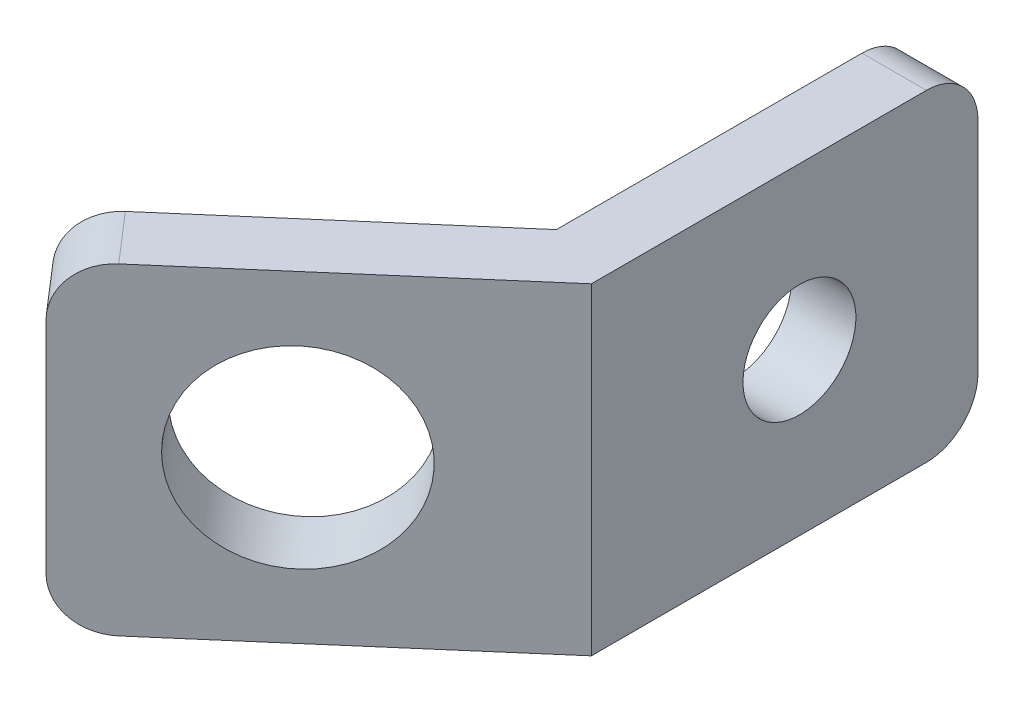
ISO-10303-21;
HEADER;
FILE_DESCRIPTION(('STEP AP214'),'2;1');
FILE_NAME('part.step','',(''),(''),'','','');
FILE_SCHEMA(('AUTOMOTIVE_DESIGN { 1 0 10303 214 1 1 1 1 }'));
ENDSEC;
DATA;
#1=APPLICATION_CONTEXT('core data for automotive mechanical design processes');
#2=APPLICATION_PROTOCOL_DEFINITION('international standard','automotive_design',2000,#1);
#3=PRODUCT_CONTEXT('',#1,'mechanical');
#4=PRODUCT('Part','Part','',(#3));
#5=PRODUCT_RELATED_PRODUCT_CATEGORY('part','',(#4));
#6=PRODUCT_DEFINITION_FORMATION('','',#4);
#7=PRODUCT_DEFINITION_CONTEXT('part definition',#1,'design');
#8=PRODUCT_DEFINITION('design','',#6,#7);
#9=PRODUCT_DEFINITION_SHAPE('','',#8);
#10=(LENGTH_UNIT() NAMED_UNIT(*) SI_UNIT(.MILLI.,.METRE.));
#11=(NAMED_UNIT(*) PLANE_ANGLE_UNIT() SI_UNIT($,.RADIAN.));
#12=(NAMED_UNIT(*) SI_UNIT($,.STERADIAN.) SOLID_ANGLE_UNIT());
#13=UNCERTAINTY_MEASURE_WITH_UNIT(LENGTH_MEASURE(1.E-05),#10,'distance_accuracy_value','');
#14=(GEOMETRIC_REPRESENTATION_CONTEXT(3) GLOBAL_UNCERTAINTY_ASSIGNED_CONTEXT((#13)) GLOBAL_UNIT_ASSIGNED_CONTEXT((#10,
#11,#12)) REPRESENTATION_CONTEXT('',''));
#15=CARTESIAN_POINT('',(0.,0.,0.));
#16=DIRECTION('',(0.,0.,1.));
#17=DIRECTION('',(1.,0.,0.));
#18=AXIS2_PLACEMENT_3D('',#15,#16,#17);
#19=CARTESIAN_POINT('',(-14.4153433207291,15.875,12.4539301806904));
#20=DIRECTION('',(-0.653749615784273,0.,-0.756710935471343));
#21=DIRECTION('',(-0.756710935471343,0.,0.653749615784273));
#22=AXIS2_PLACEMENT_3D('',#19,#20,#21);
#23=PLANE('',#22);
#24=CARTESIAN_POINT('',(-7.75734414530701,7.9375,6.70184679086469));
#25=DIRECTION('',(-0.653749615784273,0.,-0.756710935471343));
#26=DIRECTION('',(-0.756710935471343,0.,0.653749615784273));
#27=AXIS2_PLACEMENT_3D('',#24,#25,#26);
#28=CIRCLE('',#27,4.7625);
#29=CARTESIAN_POINT('',(-11.3611799754893,7.9375,9.81532933603729));
#30=VERTEX_POINT('',#29);
#31=EDGE_CURVE('E301',#30,#30,#28,.T.);
#32=ORIENTED_EDGE('',*,*,#31,.T.);
#33=EDGE_LOOP('',(#32));
#34=FACE_BOUND('',#33,.T.);
#35=DIRECTION('',(0.,-1.,0.));
#36=VECTOR('',#35,1.);
#37=CARTESIAN_POINT('',(-14.4153433207291,15.875,12.4539301806904));
#38=LINE('',#37,#36);
#39=CARTESIAN_POINT('',(-14.4153433207291,13.335,12.4539301806904));
#40=VERTEX_POINT('',#39);
#41=CARTESIAN_POINT('',(-14.4153433207291,2.54,12.4539301806904));
#42=VERTEX_POINT('',#41);
#43=EDGE_CURVE('E210',#40,#42,#38,.T.);
#44=ORIENTED_EDGE('',*,*,#43,.T.);
#45=CARTESIAN_POINT('',(-12.4932975446319,2.54,10.7934061565984));
#46=DIRECTION('',(-0.653749615784273,0.,-0.756710935471343));
#47=DIRECTION('',(-0.756710935471343,0.,0.653749615784273));
#48=AXIS2_PLACEMENT_3D('',#45,#46,#47);
#49=CIRCLE('',#48,2.54);
#50=CARTESIAN_POINT('',(-12.4932975446319,0.,10.7934061565984));
#51=VERTEX_POINT('',#50);
#52=EDGE_CURVE('E197',#42,#51,#49,.F.);
#53=ORIENTED_EDGE('',*,*,#52,.T.);
#54=DIRECTION('',(0.756710935471343,0.,-0.653749615784273));
#55=VECTOR('',#54,1.);
#56=CARTESIAN_POINT('',(-14.4153433207291,0.,12.4539301806904));
#57=LINE('',#56,#55);
#58=CARTESIAN_POINT('',(0.,0.,0.));
#59=VERTEX_POINT('',#58);
#60=EDGE_CURVE('E148',#51,#59,#57,.T.);
#61=ORIENTED_EDGE('',*,*,#60,.T.);
#62=DIRECTION('',(0.,-1.,0.));
#63=VECTOR('',#62,1.);
#64=CARTESIAN_POINT('',(0.,15.875,0.));
#65=LINE('',#64,#63);
#66=CARTESIAN_POINT('',(0.,15.875,0.));
#67=VERTEX_POINT('',#66);
#68=EDGE_CURVE('E140',#67,#59,#65,.T.);
#69=ORIENTED_EDGE('',*,*,#68,.F.);
#70=DIRECTION('',(0.756710935471343,0.,-0.653749615784273));
#71=VECTOR('',#70,1.);
#72=CARTESIAN_POINT('',(-14.4153433207291,15.875,12.4539301806904));
#73=LINE('',#72,#71);
#74=CARTESIAN_POINT('',(-12.4932975446319,15.875,10.7934061565984));
#75=VERTEX_POINT('',#74);
#76=EDGE_CURVE('E121',#75,#67,#73,.T.);
#77=ORIENTED_EDGE('',*,*,#76,.F.);
#78=CARTESIAN_POINT('',(-12.4932975446319,13.335,10.7934061565984));
#79=DIRECTION('',(-0.653749615784273,0.,-0.756710935471343));
#80=DIRECTION('',(-0.756710935471343,0.,0.653749615784273));
#81=AXIS2_PLACEMENT_3D('',#78,#79,#80);
#82=CIRCLE('',#81,2.54);
#83=EDGE_CURVE('E194',#75,#40,#82,.F.);
#84=ORIENTED_EDGE('',*,*,#83,.T.);
#85=EDGE_LOOP('',(#44,#53,#61,#69,#77,#84));
#86=FACE_BOUND('',#85,.T.);
#87=ADVANCED_FACE('F42',(#34,#86),#23,.F.);
#88=CARTESIAN_POINT('',(0.,15.875,0.));
#89=DIRECTION('',(-1.,0.,0.));
#90=DIRECTION('',(0.,0.,1.));
#91=AXIS2_PLACEMENT_3D('',#88,#89,#90);
#92=PLANE('',#91);
#93=CARTESIAN_POINT('',(0.,7.9375,-10.2513969095413));
#94=DIRECTION('',(-1.,0.,0.));
#95=DIRECTION('',(0.,0.,1.));
#96=AXIS2_PLACEMENT_3D('',#93,#94,#95);
#97=CIRCLE('',#96,2.7813);
#98=CARTESIAN_POINT('',(0.,7.9375,-7.47009690954127));
#99=VERTEX_POINT('',#98);
#100=EDGE_CURVE('E241',#99,#99,#97,.T.);
#101=ORIENTED_EDGE('',*,*,#100,.T.);
#102=EDGE_LOOP('',(#101));
#103=FACE_BOUND('',#102,.T.);
#104=DIRECTION('',(0.,-1.,0.));
#105=VECTOR('',#104,1.);
#106=CARTESIAN_POINT('',(0.,15.875,-19.05));
#107=LINE('',#106,#105);
#108=CARTESIAN_POINT('',(0.,13.335,-19.05));
#109=VERTEX_POINT('',#108);
#110=CARTESIAN_POINT('',(0.,2.54,-19.05));
#111=VERTEX_POINT('',#110);
#112=EDGE_CURVE('E151',#109,#111,#107,.T.);
#113=ORIENTED_EDGE('',*,*,#112,.F.);
#114=CARTESIAN_POINT('',(0.,13.335,-16.51));
#115=DIRECTION('',(-1.,0.,0.));
#116=DIRECTION('',(0.,0.,1.));
#117=AXIS2_PLACEMENT_3D('',#114,#115,#116);
#118=CIRCLE('',#117,2.54);
#119=CARTESIAN_POINT('',(0.,15.875,-16.51));
#120=VERTEX_POINT('',#119);
#121=EDGE_CURVE('E142',#109,#120,#118,.F.);
#122=ORIENTED_EDGE('',*,*,#121,.T.);
#123=DIRECTION('',(0.,0.,-1.));
#124=VECTOR('',#123,1.);
#125=CARTESIAN_POINT('',(0.,15.875,0.));
#126=LINE('',#125,#124);
#127=EDGE_CURVE('E125',#67,#120,#126,.T.);
#128=ORIENTED_EDGE('',*,*,#127,.F.);
#129=ORIENTED_EDGE('',*,*,#68,.T.);
#130=DIRECTION('',(0.,0.,-1.));
#131=VECTOR('',#130,1.);
#132=CARTESIAN_POINT('',(0.,0.,0.));
#133=LINE('',#132,#131);
#134=CARTESIAN_POINT('',(0.,0.,-16.51));
#135=VERTEX_POINT('',#134);
#136=EDGE_CURVE('E240',#59,#135,#133,.T.);
#137=ORIENTED_EDGE('',*,*,#136,.T.);
#138=CARTESIAN_POINT('',(0.,2.54,-16.51));
#139=DIRECTION('',(-1.,0.,0.));
#140=DIRECTION('',(0.,0.,1.));
#141=AXIS2_PLACEMENT_3D('',#138,#139,#140);
#142=CIRCLE('',#141,2.54);
#143=EDGE_CURVE('E177',#135,#111,#142,.F.);
#144=ORIENTED_EDGE('',*,*,#143,.T.);
#145=EDGE_LOOP('',(#113,#122,#128,#129,#137,#144));
#146=FACE_BOUND('',#145,.T.);
#147=ADVANCED_FACE('F138',(#103,#146),#92,.F.);
#148=CARTESIAN_POINT('',(0.,15.875,-19.05));
#149=DIRECTION('',(0.,0.,1.));
#150=DIRECTION('',(1.,0.,0.));
#151=AXIS2_PLACEMENT_3D('',#148,#149,#150);
#152=PLANE('',#151);
#153=DIRECTION('',(0.,-1.,0.));
#154=VECTOR('',#153,1.);
#155=CARTESIAN_POINT('',(-3.175,15.875,-19.05));
#156=LINE('',#155,#154);
#157=CARTESIAN_POINT('',(-3.175,13.335,-19.05));
#158=VERTEX_POINT('',#157);
#159=CARTESIAN_POINT('',(-3.175,2.54,-19.05));
#160=VERTEX_POINT('',#159);
#161=EDGE_CURVE('E158',#158,#160,#156,.T.);
#162=ORIENTED_EDGE('',*,*,#161,.F.);
#163=DIRECTION('',(-1.,0.,0.));
#164=VECTOR('',#163,1.);
#165=CARTESIAN_POINT('',(0.,13.335,-19.05));
#166=LINE('',#165,#164);
#167=EDGE_CURVE('E174',#158,#109,#166,.F.);
#168=ORIENTED_EDGE('',*,*,#167,.T.);
#169=ORIENTED_EDGE('',*,*,#112,.T.);
#170=DIRECTION('',(-1.,0.,0.));
#171=VECTOR('',#170,1.);
#172=CARTESIAN_POINT('',(-3.175,2.54,-19.05));
#173=LINE('',#172,#171);
#174=EDGE_CURVE('E170',#111,#160,#173,.T.);
#175=ORIENTED_EDGE('',*,*,#174,.T.);
#176=EDGE_LOOP('',(#162,#168,#169,#175));
#177=FACE_BOUND('',#176,.T.);
#178=ADVANCED_FACE('F231',(#177),#152,.F.);
#179=CARTESIAN_POINT('',(-3.175,15.875,-19.05));
#180=DIRECTION('',(1.,0.,0.));
#181=DIRECTION('',(0.,0.,-1.));
#182=AXIS2_PLACEMENT_3D('',#179,#180,#181);
#183=PLANE('',#182);
#184=CARTESIAN_POINT('',(-3.175,7.9375,-10.2513969095413));
#185=DIRECTION('',(-1.,0.,0.));
#186=DIRECTION('',(0.,0.,1.));
#187=AXIS2_PLACEMENT_3D('',#184,#185,#186);
#188=CIRCLE('',#187,2.7813);
#189=CARTESIAN_POINT('',(-3.175,7.9375,-7.47009690954127));
#190=VERTEX_POINT('',#189);
#191=EDGE_CURVE('E303',#190,#190,#188,.T.);
#192=ORIENTED_EDGE('',*,*,#191,.F.);
#193=EDGE_LOOP('',(#192));
#194=FACE_BOUND('',#193,.T.);
#195=DIRECTION('',(0.,0.,1.));
#196=VECTOR('',#195,1.);
#197=CARTESIAN_POINT('',(-3.175,15.875,-19.05));
#198=LINE('',#197,#196);
#199=CARTESIAN_POINT('',(-3.175,15.875,-16.51));
#200=VERTEX_POINT('',#199);
#201=CARTESIAN_POINT('',(-3.175,15.875,-1.45279381908254));
#202=VERTEX_POINT('',#201);
#203=EDGE_CURVE('E144',#200,#202,#198,.T.);
#204=ORIENTED_EDGE('',*,*,#203,.F.);
#205=CARTESIAN_POINT('',(-3.175,13.335,-16.51));
#206=DIRECTION('',(1.,0.,0.));
#207=DIRECTION('',(0.,0.,-1.));
#208=AXIS2_PLACEMENT_3D('',#205,#206,#207);
#209=CIRCLE('',#208,2.54);
#210=EDGE_CURVE('E167',#200,#158,#209,.F.);
#211=ORIENTED_EDGE('',*,*,#210,.T.);
#212=ORIENTED_EDGE('',*,*,#161,.T.);
#213=CARTESIAN_POINT('',(-3.175,2.54,-16.51));
#214=DIRECTION('',(1.,0.,0.));
#215=DIRECTION('',(0.,0.,-1.));
#216=AXIS2_PLACEMENT_3D('',#213,#214,#215);
#217=CIRCLE('',#216,2.54);
#218=CARTESIAN_POINT('',(-3.175,0.,-16.51));
#219=VERTEX_POINT('',#218);
#220=EDGE_CURVE('E164',#160,#219,#217,.F.);
#221=ORIENTED_EDGE('',*,*,#220,.T.);
#222=DIRECTION('',(0.,0.,1.));
#223=VECTOR('',#222,1.);
#224=CARTESIAN_POINT('',(-3.175,0.,-19.05));
#225=LINE('',#224,#223);
#226=CARTESIAN_POINT('',(-3.175,0.,-1.45279381908254));
#227=VERTEX_POINT('',#226);
#228=EDGE_CURVE('E243',#219,#227,#225,.T.);
#229=ORIENTED_EDGE('',*,*,#228,.T.);
#230=DIRECTION('',(0.,-1.,0.));
#231=VECTOR('',#230,1.);
#232=CARTESIAN_POINT('',(-3.175,15.875,-1.45279381908254));
#233=LINE('',#232,#231);
#234=EDGE_CURVE('E217',#202,#227,#233,.T.);
#235=ORIENTED_EDGE('',*,*,#234,.F.);
#236=EDGE_LOOP('',(#204,#211,#212,#221,#229,#235));
#237=FACE_BOUND('',#236,.T.);
#238=ADVANCED_FACE('F227',(#194,#237),#183,.F.);
#239=CARTESIAN_POINT('',(-3.175,15.875,-1.45279381908254));
#240=DIRECTION('',(0.653749615784273,0.,0.756710935471343));
#241=DIRECTION('',(0.756710935471343,0.,-0.653749615784273));
#242=AXIS2_PLACEMENT_3D('',#239,#240,#241);
#243=PLANE('',#242);
#244=CARTESIAN_POINT('',(-9.83299917542208,7.9375,4.29928957074318));
#245=DIRECTION('',(-0.653749615784273,0.,-0.756710935471343));
#246=DIRECTION('',(-0.756710935471343,0.,0.653749615784273));
#247=AXIS2_PLACEMENT_3D('',#244,#245,#246);
#248=CIRCLE('',#247,4.7625);
#249=CARTESIAN_POINT('',(-13.4368350056043,7.9375,7.41277211591578));
#250=VERTEX_POINT('',#249);
#251=EDGE_CURVE('E299',#250,#250,#248,.T.);
#252=ORIENTED_EDGE('',*,*,#251,.F.);
#253=EDGE_LOOP('',(#252));
#254=FACE_BOUND('',#253,.T.);
#255=DIRECTION('',(-0.756710935471343,0.,0.653749615784273));
#256=VECTOR('',#255,1.);
#257=CARTESIAN_POINT('',(-3.175,0.,-1.45279381908254));
#258=LINE('',#257,#256);
#259=CARTESIAN_POINT('',(-14.5689525747469,0.,8.39084893647684));
#260=VERTEX_POINT('',#259);
#261=EDGE_CURVE('E133',#227,#260,#258,.T.);
#262=ORIENTED_EDGE('',*,*,#261,.T.);
#263=CARTESIAN_POINT('',(-14.5689525747469,2.54,8.39084893647684));
#264=DIRECTION('',(0.653749615784273,0.,0.756710935471343));
#265=DIRECTION('',(0.756710935471343,0.,-0.653749615784273));
#266=AXIS2_PLACEMENT_3D('',#263,#264,#265);
#267=CIRCLE('',#266,2.54);
#268=CARTESIAN_POINT('',(-16.4909983508442,2.54,10.0513729605689));
#269=VERTEX_POINT('',#268);
#270=EDGE_CURVE('E11',#260,#269,#267,.F.);
#271=ORIENTED_EDGE('',*,*,#270,.T.);
#272=DIRECTION('',(0.,-1.,0.));
#273=VECTOR('',#272,1.);
#274=CARTESIAN_POINT('',(-16.4909983508442,15.875,10.0513729605689));
#275=LINE('',#274,#273);
#276=CARTESIAN_POINT('',(-16.4909983508442,13.335,10.0513729605689));
#277=VERTEX_POINT('',#276);
#278=EDGE_CURVE('E205',#277,#269,#275,.T.);
#279=ORIENTED_EDGE('',*,*,#278,.F.);
#280=CARTESIAN_POINT('',(-14.5689525747469,13.335,8.39084893647684));
#281=DIRECTION('',(0.653749615784273,0.,0.756710935471343));
#282=DIRECTION('',(0.756710935471343,0.,-0.653749615784273));
#283=AXIS2_PLACEMENT_3D('',#280,#281,#282);
#284=CIRCLE('',#283,2.54);
#285=CARTESIAN_POINT('',(-14.5689525747469,15.875,8.39084893647684));
#286=VERTEX_POINT('',#285);
#287=EDGE_CURVE('E51',#277,#286,#284,.F.);
#288=ORIENTED_EDGE('',*,*,#287,.T.);
#289=DIRECTION('',(-0.756710935471343,0.,0.653749615784273));
#290=VECTOR('',#289,1.);
#291=CARTESIAN_POINT('',(-3.175,15.875,-1.45279381908254));
#292=LINE('',#291,#290);
#293=EDGE_CURVE('E204',#202,#286,#292,.T.);
#294=ORIENTED_EDGE('',*,*,#293,.F.);
#295=ORIENTED_EDGE('',*,*,#234,.T.);
#296=EDGE_LOOP('',(#262,#271,#279,#288,#294,#295));
#297=FACE_BOUND('',#296,.T.);
#298=ADVANCED_FACE('F202',(#254,#297),#243,.F.);
#299=CARTESIAN_POINT('',(-16.4909983508442,15.875,10.0513729605689));
#300=DIRECTION('',(0.756710935471343,0.,-0.653749615784274));
#301=DIRECTION('',(-0.653749615784274,0.,-0.756710935471343));
#302=AXIS2_PLACEMENT_3D('',#299,#300,#301);
#303=PLANE('',#302);
#304=ORIENTED_EDGE('',*,*,#278,.T.);
#305=DIRECTION('',(0.653749615784274,0.,0.756710935471343));
#306=VECTOR('',#305,1.);
#307=CARTESIAN_POINT('',(-14.4153433207291,2.54,12.4539301806904));
#308=LINE('',#307,#306);
#309=EDGE_CURVE('E190',#269,#42,#308,.T.);
#310=ORIENTED_EDGE('',*,*,#309,.T.);
#311=ORIENTED_EDGE('',*,*,#43,.F.);
#312=DIRECTION('',(0.653749615784274,0.,0.756710935471343));
#313=VECTOR('',#312,1.);
#314=CARTESIAN_POINT('',(-16.4909983508442,13.335,10.0513729605689));
#315=LINE('',#314,#313);
#316=EDGE_CURVE('E63',#40,#277,#315,.F.);
#317=ORIENTED_EDGE('',*,*,#316,.T.);
#318=EDGE_LOOP('',(#304,#310,#311,#317));
#319=FACE_BOUND('',#318,.T.);
#320=ADVANCED_FACE('F212',(#319),#303,.F.);
#321=CARTESIAN_POINT('',(0.,15.875,0.));
#322=DIRECTION('',(0.,-1.,0.));
#323=DIRECTION('',(0.,0.,-1.));
#324=AXIS2_PLACEMENT_3D('',#321,#322,#323);
#325=PLANE('',#324);
#326=ORIENTED_EDGE('',*,*,#127,.T.);
#327=DIRECTION('',(-1.,0.,0.));
#328=VECTOR('',#327,1.);
#329=CARTESIAN_POINT('',(0.,15.875,-16.51));
#330=LINE('',#329,#328);
#331=EDGE_CURVE('E155',#120,#200,#330,.T.);
#332=ORIENTED_EDGE('',*,*,#331,.T.);
#333=ORIENTED_EDGE('',*,*,#203,.T.);
#334=ORIENTED_EDGE('',*,*,#293,.T.);
#335=DIRECTION('',(0.653749615784274,0.,0.756710935471343));
#336=VECTOR('',#335,1.);
#337=CARTESIAN_POINT('',(-12.4932975446319,15.875,10.7934061565984));
#338=LINE('',#337,#336);
#339=EDGE_CURVE('E129',#286,#75,#338,.T.);
#340=ORIENTED_EDGE('',*,*,#339,.T.);
#341=ORIENTED_EDGE('',*,*,#76,.T.);
#342=EDGE_LOOP('',(#326,#332,#333,#334,#340,#341));
#343=FACE_BOUND('',#342,.T.);
#344=ADVANCED_FACE('F123',(#343),#325,.F.);
#345=CARTESIAN_POINT('',(0.,0.,0.));
#346=DIRECTION('',(0.,-1.,0.));
#347=DIRECTION('',(0.,0.,-1.));
#348=AXIS2_PLACEMENT_3D('',#345,#346,#347);
#349=PLANE('',#348);
#350=ORIENTED_EDGE('',*,*,#228,.F.);
#351=DIRECTION('',(-1.,0.,0.));
#352=VECTOR('',#351,1.);
#353=CARTESIAN_POINT('',(0.,0.,-16.51));
#354=LINE('',#353,#352);
#355=EDGE_CURVE('E185',#219,#135,#354,.F.);
#356=ORIENTED_EDGE('',*,*,#355,.T.);
#357=ORIENTED_EDGE('',*,*,#136,.F.);
#358=ORIENTED_EDGE('',*,*,#60,.F.);
#359=DIRECTION('',(0.653749615784274,0.,0.756710935471343));
#360=VECTOR('',#359,1.);
#361=CARTESIAN_POINT('',(-14.5689525747469,0.,8.39084893647684));
#362=LINE('',#361,#360);
#363=EDGE_CURVE('E182',#51,#260,#362,.F.);
#364=ORIENTED_EDGE('',*,*,#363,.T.);
#365=ORIENTED_EDGE('',*,*,#261,.F.);
#366=EDGE_LOOP('',(#350,#356,#357,#358,#364,#365));
#367=FACE_BOUND('',#366,.T.);
#368=ADVANCED_FACE('F251',(#367),#349,.T.);
#369=CARTESIAN_POINT('',(0.,7.9375,-10.2513969095413));
#370=DIRECTION('',(-1.,0.,0.));
#371=DIRECTION('',(0.,0.,1.));
#372=AXIS2_PLACEMENT_3D('',#369,#370,#371);
#373=CYLINDRICAL_SURFACE('',#372,2.7813);
#374=ORIENTED_EDGE('',*,*,#100,.F.);
#375=EDGE_LOOP('',(#374));
#376=FACE_BOUND('',#375,.T.);
#377=ORIENTED_EDGE('',*,*,#191,.T.);
#378=EDGE_LOOP('',(#377));
#379=FACE_BOUND('',#378,.T.);
#380=ADVANCED_FACE('F287',(#376,#379),#373,.F.);
#381=CARTESIAN_POINT('',(-1.59639131956445,7.9375,13.8331096835696));
#382=DIRECTION('',(-0.653749615784273,0.,-0.756710935471343));
#383=DIRECTION('',(-0.756710935471343,0.,0.653749615784273));
#384=AXIS2_PLACEMENT_3D('',#381,#382,#383);
#385=CYLINDRICAL_SURFACE('',#384,4.7625);
#386=ORIENTED_EDGE('',*,*,#251,.T.);
#387=EDGE_LOOP('',(#386));
#388=FACE_BOUND('',#387,.T.);
#389=ORIENTED_EDGE('',*,*,#31,.F.);
#390=EDGE_LOOP('',(#389));
#391=FACE_BOUND('',#390,.T.);
#392=ADVANCED_FACE('F262',(#388,#391),#385,.F.);
#393=CARTESIAN_POINT('',(0.,13.335,-16.51));
#394=DIRECTION('',(-1.,0.,0.));
#395=DIRECTION('',(0.,0.,1.));
#396=AXIS2_PLACEMENT_3D('',#393,#394,#395);
#397=CYLINDRICAL_SURFACE('',#396,2.54);
#398=ORIENTED_EDGE('',*,*,#121,.F.);
#399=ORIENTED_EDGE('',*,*,#167,.F.);
#400=ORIENTED_EDGE('',*,*,#210,.F.);
#401=ORIENTED_EDGE('',*,*,#331,.F.);
#402=EDGE_LOOP('',(#398,#399,#400,#401));
#403=FACE_BOUND('',#402,.T.);
#404=ADVANCED_FACE('F234',(#403),#397,.T.);
#405=CARTESIAN_POINT('',(0.,2.54,-16.51));
#406=DIRECTION('',(1.,0.,0.));
#407=DIRECTION('',(0.,0.,-1.));
#408=AXIS2_PLACEMENT_3D('',#405,#406,#407);
#409=CYLINDRICAL_SURFACE('',#408,2.54);
#410=ORIENTED_EDGE('',*,*,#143,.F.);
#411=ORIENTED_EDGE('',*,*,#355,.F.);
#412=ORIENTED_EDGE('',*,*,#220,.F.);
#413=ORIENTED_EDGE('',*,*,#174,.F.);
#414=EDGE_LOOP('',(#410,#411,#412,#413));
#415=FACE_BOUND('',#414,.T.);
#416=ADVANCED_FACE('F255',(#415),#409,.T.);
#417=CARTESIAN_POINT('',(-14.5689525747469,2.54,8.39084893647684));
#418=DIRECTION('',(-0.653749615784274,0.,-0.756710935471343));
#419=DIRECTION('',(-0.756710935471343,0.,0.653749615784274));
#420=AXIS2_PLACEMENT_3D('',#417,#418,#419);
#421=CYLINDRICAL_SURFACE('',#420,2.54);
#422=ORIENTED_EDGE('',*,*,#270,.F.);
#423=ORIENTED_EDGE('',*,*,#363,.F.);
#424=ORIENTED_EDGE('',*,*,#52,.F.);
#425=ORIENTED_EDGE('',*,*,#309,.F.);
#426=EDGE_LOOP('',(#422,#423,#424,#425));
#427=FACE_BOUND('',#426,.T.);
#428=ADVANCED_FACE('F250',(#427),#421,.T.);
#429=CARTESIAN_POINT('',(-12.4932975446319,13.335,10.7934061565984));
#430=DIRECTION('',(0.653749615784274,0.,0.756710935471343));
#431=DIRECTION('',(0.756710935471343,0.,-0.653749615784274));
#432=AXIS2_PLACEMENT_3D('',#429,#430,#431);
#433=CYLINDRICAL_SURFACE('',#432,2.54);
#434=ORIENTED_EDGE('',*,*,#287,.F.);
#435=ORIENTED_EDGE('',*,*,#316,.F.);
#436=ORIENTED_EDGE('',*,*,#83,.F.);
#437=ORIENTED_EDGE('',*,*,#339,.F.);
#438=EDGE_LOOP('',(#434,#435,#436,#437));
#439=FACE_BOUND('',#438,.T.);
#440=ADVANCED_FACE('F44',(#439),#433,.T.);
#441=CLOSED_SHELL('',(#87,#147,#178,#238,#298,#320,#344,#368,#380,#392,#404,#416,#428,#440));
#442=MANIFOLD_SOLID_BREP('B2',#441);
#443=ADVANCED_BREP_SHAPE_REPRESENTATION('',(#18,#442),#14);
#444=SHAPE_DEFINITION_REPRESENTATION(#9,#443);
ENDSEC;
END-ISO-10303-21;
